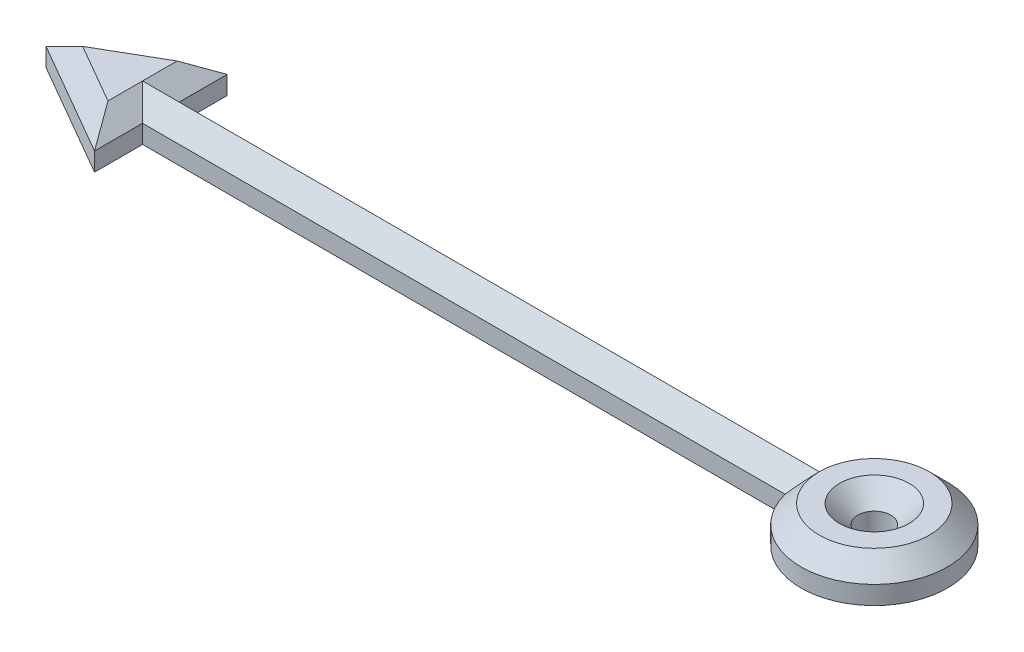
ISO-10303-21;
HEADER;
FILE_DESCRIPTION(('STEP AP214'),'2;1');
FILE_NAME('part.step','',(''),(''),'','','');
FILE_SCHEMA(('AUTOMOTIVE_DESIGN { 1 0 10303 214 1 1 1 1 }'));
ENDSEC;
DATA;
#1=APPLICATION_CONTEXT('core data for automotive mechanical design processes');
#2=APPLICATION_PROTOCOL_DEFINITION('international standard','automotive_design',2000,#1);
#3=PRODUCT_CONTEXT('',#1,'mechanical');
#4=PRODUCT('Part','Part','',(#3));
#5=PRODUCT_RELATED_PRODUCT_CATEGORY('part','',(#4));
#6=PRODUCT_DEFINITION_FORMATION('','',#4);
#7=PRODUCT_DEFINITION_CONTEXT('part definition',#1,'design');
#8=PRODUCT_DEFINITION('design','',#6,#7);
#9=PRODUCT_DEFINITION_SHAPE('','',#8);
#10=(LENGTH_UNIT() NAMED_UNIT(*) SI_UNIT(.MILLI.,.METRE.));
#11=(NAMED_UNIT(*) PLANE_ANGLE_UNIT() SI_UNIT($,.RADIAN.));
#12=(NAMED_UNIT(*) SI_UNIT($,.STERADIAN.) SOLID_ANGLE_UNIT());
#13=UNCERTAINTY_MEASURE_WITH_UNIT(LENGTH_MEASURE(1.E-05),#10,'distance_accuracy_value','');
#14=(GEOMETRIC_REPRESENTATION_CONTEXT(3) GLOBAL_UNCERTAINTY_ASSIGNED_CONTEXT((#13)) GLOBAL_UNIT_ASSIGNED_CONTEXT((#10,
#11,#12)) REPRESENTATION_CONTEXT('',''));
#15=CARTESIAN_POINT('',(0.,0.,0.));
#16=DIRECTION('',(0.,0.,1.));
#17=DIRECTION('',(1.,0.,0.));
#18=AXIS2_PLACEMENT_3D('',#15,#16,#17);
#19=CARTESIAN_POINT('',(103.236309039817,10.,-0.129552955295529));
#20=DIRECTION('',(0.,1.,0.));
#21=DIRECTION('',(0.,0.,1.));
#22=AXIS2_PLACEMENT_3D('',#19,#20,#21);
#23=PLANE('',#22);
#24=CARTESIAN_POINT('',(103.236309039817,10.,-0.129552955295529));
#25=DIRECTION('',(0.,1.,0.));
#26=DIRECTION('',(0.,0.,1.));
#27=AXIS2_PLACEMENT_3D('',#24,#25,#26);
#28=CIRCLE('',#27,9.50000000000004);
#29=CARTESIAN_POINT('',(103.236309039817,10.,9.37044704470451));
#30=VERTEX_POINT('',#29);
#31=EDGE_CURVE('E229',#30,#30,#28,.F.);
#32=ORIENTED_EDGE('',*,*,#31,.T.);
#33=EDGE_LOOP('',(#32));
#34=FACE_BOUND('',#33,.T.);
#35=CARTESIAN_POINT('',(103.236309039817,10.,-0.129552955295529));
#36=DIRECTION('',(0.,1.,0.));
#37=DIRECTION('',(0.,0.,1.));
#38=AXIS2_PLACEMENT_3D('',#35,#36,#37);
#39=CIRCLE('',#38,15.);
#40=CARTESIAN_POINT('',(88.2363090398172,10.,-0.12955295529544));
#41=VERTEX_POINT('',#40);
#42=EDGE_CURVE('E225',#41,#41,#39,.T.);
#43=ORIENTED_EDGE('',*,*,#42,.T.);
#44=EDGE_LOOP('',(#43));
#45=FACE_BOUND('',#44,.T.);
#46=ADVANCED_FACE('F71',(#34,#45),#23,.T.);
#47=DIRECTION('',(0.86602540378444,0.,0.499999999999998));
#48=VECTOR('',#47,1.);
#49=CARTESIAN_POINT('',(-88.879241818289,10.,13.6338166272667));
#50=LINE('',#49,#48);
#51=CARTESIAN_POINT('',(-112.718097218635,10.,-0.129552955295567));
#52=VERTEX_POINT('',#51);
#53=CARTESIAN_POINT('',(-96.379241818289,10.,9.30368960834455));
#54=VERTEX_POINT('',#53);
#55=EDGE_CURVE('E221',#52,#54,#50,.T.);
#56=ORIENTED_EDGE('',*,*,#55,.T.);
#57=DIRECTION('',(0.,0.,-1.));
#58=VECTOR('',#57,1.);
#59=CARTESIAN_POINT('',(-96.379241818289,10.,4.87044704470456));
#60=LINE('',#59,#58);
#61=CARTESIAN_POINT('',(-96.3792418182889,10.,-0.129552955295601));
#62=VERTEX_POINT('',#61);
#63=EDGE_CURVE('E224',#54,#62,#60,.T.);
#64=ORIENTED_EDGE('',*,*,#63,.T.);
#65=DIRECTION('',(0.,0.,-1.));
#66=VECTOR('',#65,1.);
#67=CARTESIAN_POINT('',(-96.3792418182893,10.,-18.22304955678));
#68=LINE('',#67,#66);
#69=CARTESIAN_POINT('',(-96.3792418182891,10.,-9.56279551893578));
#70=VERTEX_POINT('',#69);
#71=EDGE_CURVE('E217',#62,#70,#68,.T.);
#72=ORIENTED_EDGE('',*,*,#71,.T.);
#73=DIRECTION('',(-0.866025403784436,0.,0.500000000000004));
#74=VECTOR('',#73,1.);
#75=CARTESIAN_POINT('',(-120.218097218635,10.,4.20057406362665));
#76=LINE('',#75,#74);
#77=EDGE_CURVE('E218',#70,#52,#76,.T.);
#78=ORIENTED_EDGE('',*,*,#77,.T.);
#79=EDGE_LOOP('',(#56,#64,#72,#78));
#80=FACE_BOUND('',#79,.T.);
#81=ADVANCED_FACE('F312',(#80),#23,.T.);
#82=CARTESIAN_POINT('',(103.236309039817,0.,-0.129552955295529));
#83=DIRECTION('',(0.,1.,0.));
#84=DIRECTION('',(0.,0.,1.));
#85=AXIS2_PLACEMENT_3D('',#82,#83,#84);
#86=PLANE('',#85);
#87=DIRECTION('',(-1.,0.,0.));
#88=VECTOR('',#87,1.);
#89=CARTESIAN_POINT('',(83.8713923087801,0.,-5.12955295529563));
#90=LINE('',#89,#88);
#91=CARTESIAN_POINT('',(83.8713923087801,0.,-5.12955295529562));
#92=VERTEX_POINT('',#91);
#93=CARTESIAN_POINT('',(-91.379241818289,0.,-5.12955295529561));
#94=VERTEX_POINT('',#93);
#95=EDGE_CURVE('E163',#92,#94,#90,.T.);
#96=ORIENTED_EDGE('',*,*,#95,.F.);
#97=CARTESIAN_POINT('',(103.236309039817,0.,-0.129552955295529));
#98=DIRECTION('',(0.,1.,0.));
#99=DIRECTION('',(0.,0.,1.));
#100=AXIS2_PLACEMENT_3D('',#97,#98,#99);
#101=CIRCLE('',#100,20.);
#102=CARTESIAN_POINT('',(83.8713923087801,0.,4.87044704470456));
#103=VERTEX_POINT('',#102);
#104=EDGE_CURVE('E195',#103,#92,#101,.T.);
#105=ORIENTED_EDGE('',*,*,#104,.F.);
#106=DIRECTION('',(1.,0.,0.));
#107=VECTOR('',#106,1.);
#108=CARTESIAN_POINT('',(-91.379241818289,0.,4.87044704470456));
#109=LINE('',#108,#107);
#110=CARTESIAN_POINT('',(-91.379241818289,0.,4.87044704470456));
#111=VERTEX_POINT('',#110);
#112=EDGE_CURVE('E191',#111,#103,#109,.T.);
#113=ORIENTED_EDGE('',*,*,#112,.F.);
#114=DIRECTION('',(0.,0.,-1.));
#115=VECTOR('',#114,1.);
#116=CARTESIAN_POINT('',(-91.379241818289,0.,17.9639436461889));
#117=LINE('',#116,#115);
#118=CARTESIAN_POINT('',(-91.379241818289,0.,17.9639436461889));
#119=VERTEX_POINT('',#118);
#120=EDGE_CURVE('E187',#119,#111,#117,.T.);
#121=ORIENTED_EDGE('',*,*,#120,.F.);
#122=DIRECTION('',(0.86602540378444,0.,0.499999999999998));
#123=VECTOR('',#122,1.);
#124=CARTESIAN_POINT('',(-122.718097218635,0.,-0.129552955295528));
#125=LINE('',#124,#123);
#126=CARTESIAN_POINT('',(-122.718097218635,0.,-0.129552955295528));
#127=VERTEX_POINT('',#126);
#128=EDGE_CURVE('E183',#127,#119,#125,.T.);
#129=ORIENTED_EDGE('',*,*,#128,.F.);
#130=DIRECTION('',(-0.866025403784436,0.,0.500000000000004));
#131=VECTOR('',#130,1.);
#132=CARTESIAN_POINT('',(-91.3792418182893,0.,-18.2230495567801));
#133=LINE('',#132,#131);
#134=CARTESIAN_POINT('',(-91.3792418182893,0.,-18.2230495567801));
#135=VERTEX_POINT('',#134);
#136=EDGE_CURVE('E166',#135,#127,#133,.T.);
#137=ORIENTED_EDGE('',*,*,#136,.F.);
#138=DIRECTION('',(0.,0.,-1.));
#139=VECTOR('',#138,1.);
#140=CARTESIAN_POINT('',(-91.379241818289,0.,-5.12955295529561));
#141=LINE('',#140,#139);
#142=EDGE_CURVE('E149',#94,#135,#141,.T.);
#143=ORIENTED_EDGE('',*,*,#142,.F.);
#144=EDGE_LOOP('',(#96,#105,#113,#121,#129,#137,#143));
#145=FACE_BOUND('',#144,.T.);
#146=CARTESIAN_POINT('',(103.236309039817,0.,-0.129552955295529));
#147=DIRECTION('',(0.,1.,0.));
#148=DIRECTION('',(0.,0.,1.));
#149=AXIS2_PLACEMENT_3D('',#146,#147,#148);
#150=CIRCLE('',#149,4.5);
#151=CARTESIAN_POINT('',(103.236309039817,0.,4.37044704470448));
#152=VERTEX_POINT('',#151);
#153=EDGE_CURVE('E174',#152,#152,#150,.T.);
#154=ORIENTED_EDGE('',*,*,#153,.T.);
#155=EDGE_LOOP('',(#154));
#156=FACE_BOUND('',#155,.T.);
#157=ADVANCED_FACE('F160',(#145,#156),#86,.F.);
#158=CARTESIAN_POINT('',(83.8713923087801,10.,-5.12955295529563));
#159=DIRECTION('',(0.,0.,1.));
#160=DIRECTION('',(1.,0.,0.));
#161=AXIS2_PLACEMENT_3D('',#158,#159,#160);
#162=PLANE('',#161);
#163=DIRECTION('',(0.,-1.,0.));
#164=VECTOR('',#163,1.);
#165=CARTESIAN_POINT('',(-91.379241818289,10.,-5.12955295529561));
#166=LINE('',#165,#164);
#167=CARTESIAN_POINT('',(-91.379241818289,5.,-5.12955295529561));
#168=VERTEX_POINT('',#167);
#169=EDGE_CURVE('E146',#168,#94,#166,.T.);
#170=ORIENTED_EDGE('',*,*,#169,.F.);
#171=DIRECTION('',(1.,0.,0.));
#172=VECTOR('',#171,1.);
#173=CARTESIAN_POINT('',(83.8713923087801,5.,-5.12955295529563));
#174=LINE('',#173,#172);
#175=CARTESIAN_POINT('',(83.8713923087801,5.,-5.12955295529562));
#176=VERTEX_POINT('',#175);
#177=EDGE_CURVE('E12',#168,#176,#174,.T.);
#178=ORIENTED_EDGE('',*,*,#177,.T.);
#179=DIRECTION('',(0.,-1.,0.));
#180=VECTOR('',#179,1.);
#181=CARTESIAN_POINT('',(83.8713923087801,10.,-5.12955295529562));
#182=LINE('',#181,#180);
#183=EDGE_CURVE('E171',#176,#92,#182,.T.);
#184=ORIENTED_EDGE('',*,*,#183,.T.);
#185=ORIENTED_EDGE('',*,*,#95,.T.);
#186=EDGE_LOOP('',(#170,#178,#184,#185));
#187=FACE_BOUND('',#186,.T.);
#188=ADVANCED_FACE('F169',(#187),#162,.F.);
#189=CARTESIAN_POINT('',(-91.379241818289,10.,-5.12955295529561));
#190=DIRECTION('',(-1.,0.,0.));
#191=DIRECTION('',(0.,0.,1.));
#192=AXIS2_PLACEMENT_3D('',#189,#190,#191);
#193=PLANE('',#192);
#194=DIRECTION('',(0.,-1.,0.));
#195=VECTOR('',#194,1.);
#196=CARTESIAN_POINT('',(-91.3792418182893,10.,-18.2230495567801));
#197=LINE('',#196,#195);
#198=CARTESIAN_POINT('',(-91.3792418182893,5.,-18.2230495567801));
#199=VERTEX_POINT('',#198);
#200=EDGE_CURVE('E156',#199,#135,#197,.T.);
#201=ORIENTED_EDGE('',*,*,#200,.F.);
#202=DIRECTION('',(0.,0.,1.));
#203=VECTOR('',#202,1.);
#204=CARTESIAN_POINT('',(-91.379241818289,5.,-5.12955295529561));
#205=LINE('',#204,#203);
#206=EDGE_CURVE('E82',#199,#168,#205,.T.);
#207=ORIENTED_EDGE('',*,*,#206,.T.);
#208=ORIENTED_EDGE('',*,*,#169,.T.);
#209=ORIENTED_EDGE('',*,*,#142,.T.);
#210=EDGE_LOOP('',(#201,#207,#208,#209));
#211=FACE_BOUND('',#210,.T.);
#212=ADVANCED_FACE('F148',(#211),#193,.F.);
#213=CARTESIAN_POINT('',(-91.3792418182893,10.,-18.2230495567801));
#214=DIRECTION('',(0.500000000000004,0.,0.866025403784436));
#215=DIRECTION('',(0.866025403784436,0.,-0.500000000000004));
#216=AXIS2_PLACEMENT_3D('',#213,#214,#215);
#217=PLANE('',#216);
#218=DIRECTION('',(0.,-1.,0.));
#219=VECTOR('',#218,1.);
#220=CARTESIAN_POINT('',(-122.718097218635,10.,-0.129552955295528));
#221=LINE('',#220,#219);
#222=CARTESIAN_POINT('',(-122.718097218635,5.00000000000002,-0.129552955295528));
#223=VERTEX_POINT('',#222);
#224=EDGE_CURVE('E209',#223,#127,#221,.T.);
#225=ORIENTED_EDGE('',*,*,#224,.F.);
#226=DIRECTION('',(0.866025403784436,0.,-0.500000000000004));
#227=VECTOR('',#226,1.);
#228=CARTESIAN_POINT('',(-91.3792418182892,5.00000000000002,-18.2230495567801));
#229=LINE('',#228,#227);
#230=EDGE_CURVE('E97',#223,#199,#229,.T.);
#231=ORIENTED_EDGE('',*,*,#230,.T.);
#232=ORIENTED_EDGE('',*,*,#200,.T.);
#233=ORIENTED_EDGE('',*,*,#136,.T.);
#234=EDGE_LOOP('',(#225,#231,#232,#233));
#235=FACE_BOUND('',#234,.T.);
#236=ADVANCED_FACE('F340',(#235),#217,.F.);
#237=CARTESIAN_POINT('',(-122.718097218635,10.,-0.129552955295528));
#238=DIRECTION('',(0.499999999999998,0.,-0.86602540378444));
#239=DIRECTION('',(-0.86602540378444,0.,-0.499999999999998));
#240=AXIS2_PLACEMENT_3D('',#237,#238,#239);
#241=PLANE('',#240);
#242=DIRECTION('',(0.,-1.,0.));
#243=VECTOR('',#242,1.);
#244=CARTESIAN_POINT('',(-91.379241818289,10.,17.9639436461889));
#245=LINE('',#244,#243);
#246=CARTESIAN_POINT('',(-91.379241818289,5.00000000000001,17.9639436461889));
#247=VERTEX_POINT('',#246);
#248=EDGE_CURVE('E206',#247,#119,#245,.T.);
#249=ORIENTED_EDGE('',*,*,#248,.F.);
#250=DIRECTION('',(-0.86602540378444,0.,-0.499999999999998));
#251=VECTOR('',#250,1.);
#252=CARTESIAN_POINT('',(-122.718097218635,5.00000000000001,-0.129552955295529));
#253=LINE('',#252,#251);
#254=EDGE_CURVE('E243',#247,#223,#253,.T.);
#255=ORIENTED_EDGE('',*,*,#254,.T.);
#256=ORIENTED_EDGE('',*,*,#224,.T.);
#257=ORIENTED_EDGE('',*,*,#128,.T.);
#258=EDGE_LOOP('',(#249,#255,#256,#257));
#259=FACE_BOUND('',#258,.T.);
#260=ADVANCED_FACE('F336',(#259),#241,.F.);
#261=CARTESIAN_POINT('',(-91.379241818289,10.,17.9639436461889));
#262=DIRECTION('',(-1.,0.,0.));
#263=DIRECTION('',(0.,0.,1.));
#264=AXIS2_PLACEMENT_3D('',#261,#262,#263);
#265=PLANE('',#264);
#266=DIRECTION('',(0.,-1.,0.));
#267=VECTOR('',#266,1.);
#268=CARTESIAN_POINT('',(-91.379241818289,10.,4.87044704470456));
#269=LINE('',#268,#267);
#270=CARTESIAN_POINT('',(-91.379241818289,5.,4.87044704470456));
#271=VERTEX_POINT('',#270);
#272=EDGE_CURVE('E203',#271,#111,#269,.T.);
#273=ORIENTED_EDGE('',*,*,#272,.F.);
#274=DIRECTION('',(0.,0.,1.));
#275=VECTOR('',#274,1.);
#276=CARTESIAN_POINT('',(-91.379241818289,5.,17.9639436461889));
#277=LINE('',#276,#275);
#278=EDGE_CURVE('E240',#271,#247,#277,.T.);
#279=ORIENTED_EDGE('',*,*,#278,.T.);
#280=ORIENTED_EDGE('',*,*,#248,.T.);
#281=ORIENTED_EDGE('',*,*,#120,.T.);
#282=EDGE_LOOP('',(#273,#279,#280,#281));
#283=FACE_BOUND('',#282,.T.);
#284=ADVANCED_FACE('F332',(#283),#265,.F.);
#285=CARTESIAN_POINT('',(-91.379241818289,10.,4.87044704470456));
#286=DIRECTION('',(0.,0.,-1.));
#287=DIRECTION('',(-1.,0.,0.));
#288=AXIS2_PLACEMENT_3D('',#285,#286,#287);
#289=PLANE('',#288);
#290=DIRECTION('',(0.,-1.,0.));
#291=VECTOR('',#290,1.);
#292=CARTESIAN_POINT('',(83.8713923087801,10.,4.87044704470456));
#293=LINE('',#292,#291);
#294=CARTESIAN_POINT('',(83.8713923087801,5.,4.87044704470456));
#295=VERTEX_POINT('',#294);
#296=EDGE_CURVE('E200',#295,#103,#293,.T.);
#297=ORIENTED_EDGE('',*,*,#296,.F.);
#298=DIRECTION('',(-1.,0.,0.));
#299=VECTOR('',#298,1.);
#300=CARTESIAN_POINT('',(-91.379241818289,5.,4.87044704470456));
#301=LINE('',#300,#299);
#302=EDGE_CURVE('E237',#295,#271,#301,.T.);
#303=ORIENTED_EDGE('',*,*,#302,.T.);
#304=ORIENTED_EDGE('',*,*,#272,.T.);
#305=ORIENTED_EDGE('',*,*,#112,.T.);
#306=EDGE_LOOP('',(#297,#303,#304,#305));
#307=FACE_BOUND('',#306,.T.);
#308=ADVANCED_FACE('F328',(#307),#289,.F.);
#309=CARTESIAN_POINT('',(103.236309039817,10.,-0.129552955295529));
#310=DIRECTION('',(0.,-1.,0.));
#311=DIRECTION('',(0.,0.,-1.));
#312=AXIS2_PLACEMENT_3D('',#309,#310,#311);
#313=CYLINDRICAL_SURFACE('',#312,20.);
#314=ORIENTED_EDGE('',*,*,#183,.F.);
#315=CARTESIAN_POINT('',(103.236309039817,5.,-0.129552955295529));
#316=DIRECTION('',(0.,1.,0.));
#317=DIRECTION('',(0.,0.,1.));
#318=AXIS2_PLACEMENT_3D('',#315,#316,#317);
#319=CIRCLE('',#318,20.);
#320=EDGE_CURVE('E233',#176,#295,#319,.F.);
#321=ORIENTED_EDGE('',*,*,#320,.T.);
#322=ORIENTED_EDGE('',*,*,#296,.T.);
#323=ORIENTED_EDGE('',*,*,#104,.T.);
#324=EDGE_LOOP('',(#314,#321,#322,#323));
#325=FACE_BOUND('',#324,.T.);
#326=ADVANCED_FACE('F325',(#325),#313,.T.);
#327=CARTESIAN_POINT('',(103.236309039817,10.,-0.129552955295529));
#328=DIRECTION('',(0.,-1.,0.));
#329=DIRECTION('',(0.,0.,-1.));
#330=AXIS2_PLACEMENT_3D('',#327,#328,#329);
#331=CYLINDRICAL_SURFACE('',#330,4.5);
#332=CARTESIAN_POINT('',(103.236309039817,4.99999999999998,-0.129552955295529));
#333=DIRECTION('',(0.,1.,0.));
#334=DIRECTION('',(0.,0.,1.));
#335=AXIS2_PLACEMENT_3D('',#332,#333,#334);
#336=CIRCLE('',#335,4.5);
#337=CARTESIAN_POINT('',(103.236309039817,4.99999999999998,4.37044704470448));
#338=VERTEX_POINT('',#337);
#339=EDGE_CURVE('E155',#338,#338,#336,.T.);
#340=ORIENTED_EDGE('',*,*,#339,.T.);
#341=EDGE_LOOP('',(#340));
#342=FACE_BOUND('',#341,.T.);
#343=ORIENTED_EDGE('',*,*,#153,.F.);
#344=EDGE_LOOP('',(#343));
#345=FACE_BOUND('',#344,.T.);
#346=ADVANCED_FACE('F323',(#342,#345),#331,.F.);
#347=CARTESIAN_POINT('',(103.236309039817,4.99999999999998,-0.129552955295529));
#348=DIRECTION('',(0.,1.,0.));
#349=DIRECTION('',(0.,0.,1.));
#350=AXIS2_PLACEMENT_3D('',#347,#348,#349);
#351=CONICAL_SURFACE('',#350,4.5,0.78539816339745);
#352=ORIENTED_EDGE('',*,*,#31,.F.);
#353=EDGE_LOOP('',(#352));
#354=FACE_BOUND('',#353,.T.);
#355=ORIENTED_EDGE('',*,*,#339,.F.);
#356=EDGE_LOOP('',(#355));
#357=FACE_BOUND('',#356,.T.);
#358=ADVANCED_FACE('F308',(#354,#357),#351,.F.);
#359=CARTESIAN_POINT('',(49.2477074752045,10.,93.3814479842066));
#360=DIRECTION('',(-0.353553390593272,0.707106781186548,0.612372435695794));
#361=DIRECTION('',(-0.86602540378444,0.,-0.499999999999998));
#362=AXIS2_PLACEMENT_3D('',#359,#360,#361);
#363=PLANE('',#362);
#364=DIRECTION('',(-0.447213595499958,0.447213595499958,-0.774596669241483));
#365=VECTOR('',#364,1.);
#366=CARTESIAN_POINT('',(-38.1284621008917,-48.2507797173973,110.196999659379));
#367=LINE('',#366,#365);
#368=EDGE_CURVE('E495',#54,#247,#367,.F.);
#369=ORIENTED_EDGE('',*,*,#368,.F.);
#370=ORIENTED_EDGE('',*,*,#55,.F.);
#371=DIRECTION('',(0.894427190999916,0.447213595499958,0.));
#372=VECTOR('',#371,1.);
#373=CARTESIAN_POINT('',(16.8545465364359,74.7863218775354,-0.129552955295986));
#374=LINE('',#373,#372);
#375=EDGE_CURVE('E178',#223,#52,#374,.T.);
#376=ORIENTED_EDGE('',*,*,#375,.F.);
#377=ORIENTED_EDGE('',*,*,#254,.F.);
#378=EDGE_LOOP('',(#369,#370,#376,#377));
#379=FACE_BOUND('',#378,.T.);
#380=ADVANCED_FACE('F74',(#379),#363,.T.);
#381=CARTESIAN_POINT('',(49.2477074752032,10.,-93.6405538947985));
#382=DIRECTION('',(-0.353553390593276,0.707106781186548,-0.612372435695792));
#383=DIRECTION('',(0.866025403784436,0.,-0.500000000000004));
#384=AXIS2_PLACEMENT_3D('',#381,#382,#383);
#385=PLANE('',#384);
#386=ORIENTED_EDGE('',*,*,#375,.T.);
#387=ORIENTED_EDGE('',*,*,#77,.F.);
#388=DIRECTION('',(-0.447213595499948,0.447213595499961,0.774596669241487));
#389=VECTOR('',#388,1.);
#390=CARTESIAN_POINT('',(-99.6470128983596,13.2677710800706,-3.90284998074935));
#391=LINE('',#390,#389);
#392=EDGE_CURVE('E492',#199,#70,#391,.T.);
#393=ORIENTED_EDGE('',*,*,#392,.F.);
#394=ORIENTED_EDGE('',*,*,#230,.F.);
#395=EDGE_LOOP('',(#386,#387,#393,#394));
#396=FACE_BOUND('',#395,.T.);
#397=ADVANCED_FACE('F299',(#396),#385,.T.);
#398=CARTESIAN_POINT('',(-96.379241818289,10.,-0.129552955295529));
#399=DIRECTION('',(0.707106781186547,0.707106781186547,0.));
#400=DIRECTION('',(0.,0.,1.));
#401=AXIS2_PLACEMENT_3D('',#398,#399,#400);
#402=PLANE('',#401);
#403=ORIENTED_EDGE('',*,*,#368,.T.);
#404=ORIENTED_EDGE('',*,*,#278,.F.);
#405=DIRECTION('',(-0.577350269189626,0.577350269189626,-0.577350269189626));
#406=VECTOR('',#405,1.);
#407=CARTESIAN_POINT('',(-29.8407248655869,-56.5385169527021,66.4089639974066));
#408=LINE('',#407,#406);
#409=EDGE_CURVE('E480',#62,#271,#408,.F.);
#410=ORIENTED_EDGE('',*,*,#409,.F.);
#411=ORIENTED_EDGE('',*,*,#63,.F.);
#412=EDGE_LOOP('',(#403,#404,#410,#411));
#413=FACE_BOUND('',#412,.T.);
#414=ADVANCED_FACE('F293',(#413),#402,.T.);
#415=CARTESIAN_POINT('',(-96.3792418182889,10.,-0.129552955291721));
#416=DIRECTION('',(0.707106781186547,0.707106781186548,0.));
#417=DIRECTION('',(0.,0.,1.));
#418=AXIS2_PLACEMENT_3D('',#415,#416,#417);
#419=PLANE('',#418);
#420=ORIENTED_EDGE('',*,*,#392,.T.);
#421=ORIENTED_EDGE('',*,*,#71,.F.);
#422=DIRECTION('',(-0.57735026918962,0.577350269189629,0.577350269189629));
#423=VECTOR('',#422,1.);
#424=CARTESIAN_POINT('',(-96.3792418182902,10.0000000000013,-0.129552955294308));
#425=LINE('',#424,#423);
#426=EDGE_CURVE('E477',#168,#62,#425,.T.);
#427=ORIENTED_EDGE('',*,*,#426,.F.);
#428=ORIENTED_EDGE('',*,*,#206,.F.);
#429=EDGE_LOOP('',(#420,#421,#427,#428));
#430=FACE_BOUND('',#429,.T.);
#431=ADVANCED_FACE('F286',(#430),#419,.T.);
#432=CARTESIAN_POINT('',(103.236309039817,10.,-0.12955295529544));
#433=DIRECTION('',(0.,0.707106781186547,0.707106781186547));
#434=DIRECTION('',(-1.,0.,0.));
#435=AXIS2_PLACEMENT_3D('',#432,#433,#434);
#436=PLANE('',#435);
#437=DIRECTION('',(1.,0.,0.));
#438=VECTOR('',#437,1.);
#439=CARTESIAN_POINT('',(83.8713923087801,10.,-0.12955295529544));
#440=LINE('',#439,#438);
#441=EDGE_CURVE('E500',#62,#41,#440,.T.);
#442=ORIENTED_EDGE('',*,*,#441,.F.);
#443=ORIENTED_EDGE('',*,*,#409,.T.);
#444=ORIENTED_EDGE('',*,*,#302,.F.);
#445=CARTESIAN_POINT('',(83.8713923087801,5.,4.87044704470456));
#446=CARTESIAN_POINT('',(84.0378528974888,5.21489540333908,4.65555164136548));
#447=CARTESIAN_POINT('',(84.2059585803332,5.42915293994497,4.44129410475959));
#448=CARTESIAN_POINT('',(84.5456613360367,5.85628535286903,4.01416169183553));
#449=CARTESIAN_POINT('',(84.7172584845586,6.06916019909105,3.80128684561351));
#450=CARTESIAN_POINT('',(85.2372899538774,6.70518405020419,3.16526299450037));
#451=CARTESIAN_POINT('',(85.5912401178745,7.12608965101031,2.74435739369425));
#452=CARTESIAN_POINT('',(86.3157617651077,7.96087996549828,1.90956707920628));
#453=CARTESIAN_POINT('',(86.6863379707147,8.37476263782827,1.49568440687629));
#454=CARTESIAN_POINT('',(87.2563618803931,8.98924623621342,0.881200808491137));
#455=CARTESIAN_POINT('',(87.4488113890371,9.19309943747614,0.677347607228422));
#456=CARTESIAN_POINT('',(87.8387219842615,9.5984087601063,0.272038284598263));
#457=CARTESIAN_POINT('',(88.0361833179305,9.7998647625671,0.0705822821374656));
#458=CARTESIAN_POINT('',(88.2363090398172,10.,-0.129552955295443));
#459=B_SPLINE_CURVE_WITH_KNOTS('',3,(#445,#446,#447,#448,#449,#450,#451,#452,#453,#454,#455,
#456,#457,#458),.UNSPECIFIED.,.F.,.F.,(4,2,2,2,2,2,4),(0.,1.03952159825982,2.079065747817,
4.15642752909914,6.23438313540408,7.27421179369868,8.31409181670094),.UNSPECIFIED.);
#460=EDGE_CURVE('E260',#41,#295,#459,.F.);
#461=ORIENTED_EDGE('',*,*,#460,.F.);
#462=EDGE_LOOP('',(#442,#443,#444,#461));
#463=FACE_BOUND('',#462,.T.);
#464=ADVANCED_FACE('F278',(#463),#436,.T.);
#465=CARTESIAN_POINT('',(103.236309039817,10.,-0.129552955295626));
#466=DIRECTION('',(0.,0.707106781186547,-0.707106781186548));
#467=DIRECTION('',(1.,0.,0.));
#468=AXIS2_PLACEMENT_3D('',#465,#466,#467);
#469=PLANE('',#468);
#470=ORIENTED_EDGE('',*,*,#426,.T.);
#471=ORIENTED_EDGE('',*,*,#441,.T.);
#472=CARTESIAN_POINT('',(88.2363090398172,10.,-0.129552955295624));
#473=CARTESIAN_POINT('',(88.0361833179305,9.79986476256709,-0.329688192728532));
#474=CARTESIAN_POINT('',(87.8387219842615,9.5984087601063,-0.531144195189329));
#475=CARTESIAN_POINT('',(87.4488113890371,9.19309943747614,-0.936453517819488));
#476=CARTESIAN_POINT('',(87.2563618803931,8.98924623621342,-1.1403067190822));
#477=CARTESIAN_POINT('',(86.6863379707147,8.37476263782827,-1.75479031746736));
#478=CARTESIAN_POINT('',(86.3157617651077,7.96087996549828,-2.16867298979734));
#479=CARTESIAN_POINT('',(85.5912401178745,7.12608965101031,-3.00346330428532));
#480=CARTESIAN_POINT('',(85.2372899538774,6.70518405020419,-3.42436890509143));
#481=CARTESIAN_POINT('',(84.7172584845586,6.06916019909105,-4.06039275620458));
#482=CARTESIAN_POINT('',(84.5456613360367,5.85628535286903,-4.27326760242659));
#483=CARTESIAN_POINT('',(84.2059585803332,5.42915293994496,-4.70040001535066));
#484=CARTESIAN_POINT('',(84.0378528974888,5.21489540333908,-4.91465755195655));
#485=CARTESIAN_POINT('',(83.8713923087801,4.99999999999999,-5.12955295529563));
#486=B_SPLINE_CURVE_WITH_KNOTS('',3,(#472,#473,#474,#475,#476,#477,#478,#479,#480,#481,#482,
#483,#484,#485),.UNSPECIFIED.,.F.,.F.,(4,2,2,2,2,2,4),(0.,1.03988002300225,2.07970868129685,
4.1576642876018,6.23502606888393,7.27457021844111,8.31409181670093),.UNSPECIFIED.);
#487=EDGE_CURVE('E250',#176,#41,#486,.F.);
#488=ORIENTED_EDGE('',*,*,#487,.F.);
#489=ORIENTED_EDGE('',*,*,#177,.F.);
#490=EDGE_LOOP('',(#470,#471,#488,#489));
#491=FACE_BOUND('',#490,.T.);
#492=ADVANCED_FACE('F272',(#491),#469,.T.);
#493=CARTESIAN_POINT('',(103.236309039817,10.,-0.129552955295529));
#494=DIRECTION('',(0.,-1.,0.));
#495=DIRECTION('',(0.,0.,-1.));
#496=AXIS2_PLACEMENT_3D('',#493,#494,#495);
#497=CONICAL_SURFACE('',#496,15.,0.785398163397448);
#498=ORIENTED_EDGE('',*,*,#460,.T.);
#499=ORIENTED_EDGE('',*,*,#320,.F.);
#500=ORIENTED_EDGE('',*,*,#487,.T.);
#501=ORIENTED_EDGE('',*,*,#42,.F.);
#502=EDGE_LOOP('',(#498,#499,#500,#501));
#503=FACE_BOUND('',#502,.T.);
#504=ADVANCED_FACE('F268',(#503),#497,.T.);
#505=CLOSED_SHELL('',(#46,#81,#157,#188,#212,#236,#260,#284,#308,#326,#346,#358,#380,#397,#414,
#431,#464,#492,#504));
#506=MANIFOLD_SOLID_BREP('B2',#505);
#507=ADVANCED_BREP_SHAPE_REPRESENTATION('',(#18,#506),#14);
#508=SHAPE_DEFINITION_REPRESENTATION(#9,#507);
ENDSEC;
END-ISO-10303-21;
